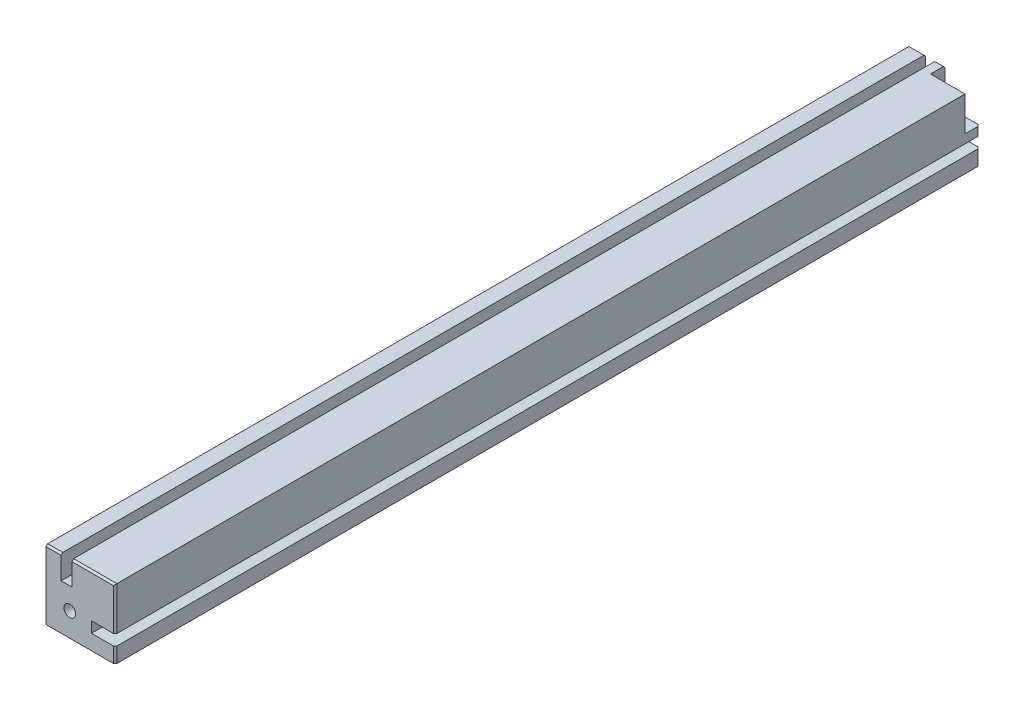
ISO-10303-21;
HEADER;
FILE_DESCRIPTION(('STEP AP214'),'2;1');
FILE_NAME('part.step','',(''),(''),'','','');
FILE_SCHEMA(('AUTOMOTIVE_DESIGN { 1 0 10303 214 1 1 1 1 }'));
ENDSEC;
DATA;
#1=APPLICATION_CONTEXT('core data for automotive mechanical design processes');
#2=APPLICATION_PROTOCOL_DEFINITION('international standard','automotive_design',2000,#1);
#3=PRODUCT_CONTEXT('',#1,'mechanical');
#4=PRODUCT('Part','Part','',(#3));
#5=PRODUCT_RELATED_PRODUCT_CATEGORY('part','',(#4));
#6=PRODUCT_DEFINITION_FORMATION('','',#4);
#7=PRODUCT_DEFINITION_CONTEXT('part definition',#1,'design');
#8=PRODUCT_DEFINITION('design','',#6,#7);
#9=PRODUCT_DEFINITION_SHAPE('','',#8);
#10=(LENGTH_UNIT() NAMED_UNIT(*) SI_UNIT(.MILLI.,.METRE.));
#11=(NAMED_UNIT(*) PLANE_ANGLE_UNIT() SI_UNIT($,.RADIAN.));
#12=(NAMED_UNIT(*) SI_UNIT($,.STERADIAN.) SOLID_ANGLE_UNIT());
#13=UNCERTAINTY_MEASURE_WITH_UNIT(LENGTH_MEASURE(1.E-05),#10,'distance_accuracy_value','');
#14=(GEOMETRIC_REPRESENTATION_CONTEXT(3) GLOBAL_UNCERTAINTY_ASSIGNED_CONTEXT((#13)) GLOBAL_UNIT_ASSIGNED_CONTEXT((#10,
#11,#12)) REPRESENTATION_CONTEXT('',''));
#15=CARTESIAN_POINT('',(0.,0.,0.));
#16=DIRECTION('',(0.,0.,1.));
#17=DIRECTION('',(1.,0.,0.));
#18=AXIS2_PLACEMENT_3D('',#15,#16,#17);
#19=CARTESIAN_POINT('',(-55.8158460090952,14.9214285714286,200.));
#20=DIRECTION('',(-1.,0.,0.));
#21=DIRECTION('',(0.,-1.,0.));
#22=AXIS2_PLACEMENT_3D('',#19,#20,#21);
#23=PLANE('',#22);
#24=DIRECTION('',(0.,0.,1.));
#25=VECTOR('',#24,1.);
#26=CARTESIAN_POINT('',(-55.8158460090952,2.42142857142858,0.));
#27=LINE('',#26,#25);
#28=CARTESIAN_POINT('',(-55.8158460090952,2.42142857142858,0.399999999999963));
#29=VERTEX_POINT('',#28);
#30=CARTESIAN_POINT('',(-55.8158460090952,2.42142857142858,199.6));
#31=VERTEX_POINT('',#30);
#32=EDGE_CURVE('E274',#29,#31,#27,.T.);
#33=ORIENTED_EDGE('',*,*,#32,.T.);
#34=DIRECTION('',(0.,-1.,0.));
#35=VECTOR('',#34,1.);
#36=CARTESIAN_POINT('',(-55.8158460090952,-1.07857142857142,199.6));
#37=LINE('',#36,#35);
#38=CARTESIAN_POINT('',(-55.8158460090952,-1.07857142857142,199.6));
#39=VERTEX_POINT('',#38);
#40=EDGE_CURVE('E355',#31,#39,#37,.T.);
#41=ORIENTED_EDGE('',*,*,#40,.T.);
#42=DIRECTION('',(0.,0.,-1.));
#43=VECTOR('',#42,1.);
#44=CARTESIAN_POINT('',(-55.8158460090952,-1.07857142857142,200.));
#45=LINE('',#44,#43);
#46=CARTESIAN_POINT('',(-55.8158460090952,-1.07857142857142,0.399999999999963));
#47=VERTEX_POINT('',#46);
#48=EDGE_CURVE('E322',#39,#47,#45,.T.);
#49=ORIENTED_EDGE('',*,*,#48,.T.);
#50=DIRECTION('',(0.,1.,0.));
#51=VECTOR('',#50,1.);
#52=CARTESIAN_POINT('',(-55.8158460090952,14.9214285714286,0.399999999999963));
#53=LINE('',#52,#51);
#54=EDGE_CURVE('E352',#47,#29,#53,.T.);
#55=ORIENTED_EDGE('',*,*,#54,.T.);
#56=EDGE_LOOP('',(#33,#41,#49,#55));
#57=FACE_BOUND('',#56,.T.);
#58=ADVANCED_FACE('F39',(#57),#23,.F.);
#59=CARTESIAN_POINT('',(-71.8158460090952,14.9214285714286,200.));
#60=DIRECTION('',(0.,-1.,0.));
#61=DIRECTION('',(0.,0.,-1.));
#62=AXIS2_PLACEMENT_3D('',#59,#60,#61);
#63=PLANE('',#62);
#64=DIRECTION('',(0.,0.,-1.));
#65=VECTOR('',#64,1.);
#66=CARTESIAN_POINT('',(-71.8158460090952,14.9214285714286,200.));
#67=LINE('',#66,#65);
#68=CARTESIAN_POINT('',(-71.8158460090952,14.9214285714286,199.6));
#69=VERTEX_POINT('',#68);
#70=CARTESIAN_POINT('',(-71.8158460090952,14.9214285714286,0.399999999999963));
#71=VERTEX_POINT('',#70);
#72=EDGE_CURVE('E331',#69,#71,#67,.T.);
#73=ORIENTED_EDGE('',*,*,#72,.F.);
#74=DIRECTION('',(1.,0.,0.));
#75=VECTOR('',#74,1.);
#76=CARTESIAN_POINT('',(-68.3158460090952,14.9214285714286,199.6));
#77=LINE('',#76,#75);
#78=CARTESIAN_POINT('',(-68.3158460090952,14.9214285714286,199.6));
#79=VERTEX_POINT('',#78);
#80=EDGE_CURVE('E384',#69,#79,#77,.T.);
#81=ORIENTED_EDGE('',*,*,#80,.T.);
#82=DIRECTION('',(0.,0.,1.));
#83=VECTOR('',#82,1.);
#84=CARTESIAN_POINT('',(-68.3158460090952,14.9214285714286,0.));
#85=LINE('',#84,#83);
#86=CARTESIAN_POINT('',(-68.3158460090952,14.9214285714286,0.399999999999963));
#87=VERTEX_POINT('',#86);
#88=EDGE_CURVE('E279',#87,#79,#85,.T.);
#89=ORIENTED_EDGE('',*,*,#88,.F.);
#90=DIRECTION('',(-1.,0.,0.));
#91=VECTOR('',#90,1.);
#92=CARTESIAN_POINT('',(-71.8158460090952,14.9214285714286,0.399999999999963));
#93=LINE('',#92,#91);
#94=EDGE_CURVE('E381',#87,#71,#93,.T.);
#95=ORIENTED_EDGE('',*,*,#94,.T.);
#96=EDGE_LOOP('',(#73,#81,#89,#95));
#97=FACE_BOUND('',#96,.T.);
#98=ADVANCED_FACE('F506',(#97),#63,.F.);
#99=DIRECTION('',(0.,0.,-1.));
#100=VECTOR('',#99,1.);
#101=CARTESIAN_POINT('',(-55.8158460090952,6.92142857142858,3.));
#102=LINE('',#101,#100);
#103=CARTESIAN_POINT('',(-55.8158460090952,6.92142857142858,3.39999999999999));
#104=VERTEX_POINT('',#103);
#105=CARTESIAN_POINT('',(-55.8158460090952,6.92142857142858,0.39999999999997));
#106=VERTEX_POINT('',#105);
#107=EDGE_CURVE('E63',#104,#106,#102,.T.);
#108=ORIENTED_EDGE('',*,*,#107,.F.);
#109=DIRECTION('',(0.,1.,0.));
#110=VECTOR('',#109,1.);
#111=CARTESIAN_POINT('',(-55.8158460090952,14.9214285714286,3.39999999999999));
#112=LINE('',#111,#110);
#113=CARTESIAN_POINT('',(-55.8158460090952,14.9214285714286,3.39999999999999));
#114=VERTEX_POINT('',#113);
#115=EDGE_CURVE('E407',#104,#114,#112,.T.);
#116=ORIENTED_EDGE('',*,*,#115,.T.);
#117=DIRECTION('',(0.,0.,-1.));
#118=VECTOR('',#117,1.);
#119=CARTESIAN_POINT('',(-55.8158460090952,14.9214285714286,200.));
#120=LINE('',#119,#118);
#121=CARTESIAN_POINT('',(-55.8158460090952,14.9214285714286,199.6));
#122=VERTEX_POINT('',#121);
#123=EDGE_CURVE('E334',#122,#114,#120,.T.);
#124=ORIENTED_EDGE('',*,*,#123,.F.);
#125=DIRECTION('',(0.,-1.,0.));
#126=VECTOR('',#125,1.);
#127=CARTESIAN_POINT('',(-55.8158460090952,4.92142857142858,199.6));
#128=LINE('',#127,#126);
#129=CARTESIAN_POINT('',(-55.8158460090952,4.92142857142858,199.6));
#130=VERTEX_POINT('',#129);
#131=EDGE_CURVE('E363',#122,#130,#128,.T.);
#132=ORIENTED_EDGE('',*,*,#131,.T.);
#133=DIRECTION('',(0.,0.,1.));
#134=VECTOR('',#133,1.);
#135=CARTESIAN_POINT('',(-55.8158460090952,4.92142857142858,0.));
#136=LINE('',#135,#134);
#137=CARTESIAN_POINT('',(-55.8158460090952,4.92142857142858,0.399999999999963));
#138=VERTEX_POINT('',#137);
#139=EDGE_CURVE('E299',#138,#130,#136,.T.);
#140=ORIENTED_EDGE('',*,*,#139,.F.);
#141=DIRECTION('',(0.,1.,0.));
#142=VECTOR('',#141,1.);
#143=CARTESIAN_POINT('',(-55.8158460090952,14.9214285714286,0.399999999999963));
#144=LINE('',#143,#142);
#145=EDGE_CURVE('E361',#138,#106,#144,.T.);
#146=ORIENTED_EDGE('',*,*,#145,.T.);
#147=EDGE_LOOP('',(#108,#116,#124,#132,#140,#146));
#148=FACE_BOUND('',#147,.T.);
#149=ADVANCED_FACE('F418',(#148),#23,.F.);
#150=ORIENTED_EDGE('',*,*,#123,.T.);
#151=DIRECTION('',(-1.,0.,0.));
#152=VECTOR('',#151,1.);
#153=CARTESIAN_POINT('',(-63.8158460090952,14.9214285714286,3.39999999999999));
#154=LINE('',#153,#152);
#155=CARTESIAN_POINT('',(-63.8158460090952,14.9214285714286,3.39999999999999));
#156=VERTEX_POINT('',#155);
#157=EDGE_CURVE('E409',#114,#156,#154,.T.);
#158=ORIENTED_EDGE('',*,*,#157,.T.);
#159=DIRECTION('',(0.,0.,-1.));
#160=VECTOR('',#159,1.);
#161=CARTESIAN_POINT('',(-63.8158460090952,14.9214285714286,3.));
#162=LINE('',#161,#160);
#163=CARTESIAN_POINT('',(-63.8158460090952,14.9214285714286,0.399999999999964));
#164=VERTEX_POINT('',#163);
#165=EDGE_CURVE('E55',#156,#164,#162,.T.);
#166=ORIENTED_EDGE('',*,*,#165,.T.);
#167=DIRECTION('',(-1.,0.,0.));
#168=VECTOR('',#167,1.);
#169=CARTESIAN_POINT('',(-71.8158460090952,14.9214285714286,0.399999999999963));
#170=LINE('',#169,#168);
#171=CARTESIAN_POINT('',(-65.8158460090952,14.9214285714286,0.399999999999963));
#172=VERTEX_POINT('',#171);
#173=EDGE_CURVE('E373',#164,#172,#170,.T.);
#174=ORIENTED_EDGE('',*,*,#173,.T.);
#175=DIRECTION('',(0.,0.,1.));
#176=VECTOR('',#175,1.);
#177=CARTESIAN_POINT('',(-65.8158460090952,14.9214285714286,0.));
#178=LINE('',#177,#176);
#179=CARTESIAN_POINT('',(-65.8158460090952,14.9214285714286,199.6));
#180=VERTEX_POINT('',#179);
#181=EDGE_CURVE('E283',#172,#180,#178,.T.);
#182=ORIENTED_EDGE('',*,*,#181,.T.);
#183=DIRECTION('',(1.,0.,0.));
#184=VECTOR('',#183,1.);
#185=CARTESIAN_POINT('',(-55.8158460090952,14.9214285714286,199.6));
#186=LINE('',#185,#184);
#187=EDGE_CURVE('E375',#180,#122,#186,.T.);
#188=ORIENTED_EDGE('',*,*,#187,.T.);
#189=EDGE_LOOP('',(#150,#158,#166,#174,#182,#188));
#190=FACE_BOUND('',#189,.T.);
#191=ADVANCED_FACE('F422',(#190),#63,.F.);
#192=CARTESIAN_POINT('',(-71.8158460090952,14.9214285714286,200.));
#193=DIRECTION('',(1.,0.,0.));
#194=DIRECTION('',(0.,1.,0.));
#195=AXIS2_PLACEMENT_3D('',#192,#193,#194);
#196=PLANE('',#195);
#197=DIRECTION('',(0.,-1.,0.));
#198=VECTOR('',#197,1.);
#199=CARTESIAN_POINT('',(-71.8158460090952,14.9214285714286,200.));
#200=LINE('',#199,#198);
#201=CARTESIAN_POINT('',(-71.8158460090952,14.5214285714286,200.));
#202=VERTEX_POINT('',#201);
#203=CARTESIAN_POINT('',(-71.8158460090952,-1.07857142857142,200.));
#204=VERTEX_POINT('',#203);
#205=EDGE_CURVE('E316',#202,#204,#200,.T.);
#206=ORIENTED_EDGE('',*,*,#205,.F.);
#207=DIRECTION('',(0.,0.707106781186548,-0.707106781186548));
#208=VECTOR('',#207,1.);
#209=CARTESIAN_POINT('',(-71.8158460090952,14.5214285714286,200.));
#210=LINE('',#209,#208);
#211=EDGE_CURVE('E379',#202,#69,#210,.T.);
#212=ORIENTED_EDGE('',*,*,#211,.T.);
#213=ORIENTED_EDGE('',*,*,#72,.T.);
#214=DIRECTION('',(0.,0.707106781186548,0.707106781186548));
#215=VECTOR('',#214,1.);
#216=CARTESIAN_POINT('',(-71.8158460090952,14.9214285714286,0.399999999999963));
#217=LINE('',#216,#215);
#218=CARTESIAN_POINT('',(-71.8158460090952,14.5214285714286,0.));
#219=VERTEX_POINT('',#218);
#220=EDGE_CURVE('E377',#71,#219,#217,.F.);
#221=ORIENTED_EDGE('',*,*,#220,.T.);
#222=DIRECTION('',(0.,-1.,0.));
#223=VECTOR('',#222,1.);
#224=CARTESIAN_POINT('',(-71.8158460090952,14.9214285714286,0.));
#225=LINE('',#224,#223);
#226=CARTESIAN_POINT('',(-71.8158460090952,-1.07857142857142,0.));
#227=VERTEX_POINT('',#226);
#228=EDGE_CURVE('E282',#219,#227,#225,.T.);
#229=ORIENTED_EDGE('',*,*,#228,.T.);
#230=DIRECTION('',(0.,0.,-1.));
#231=VECTOR('',#230,1.);
#232=CARTESIAN_POINT('',(-71.8158460090952,-1.07857142857142,200.));
#233=LINE('',#232,#231);
#234=EDGE_CURVE('E328',#204,#227,#233,.T.);
#235=ORIENTED_EDGE('',*,*,#234,.F.);
#236=EDGE_LOOP('',(#206,#212,#213,#221,#229,#235));
#237=FACE_BOUND('',#236,.T.);
#238=ADVANCED_FACE('F491',(#237),#196,.F.);
#239=CARTESIAN_POINT('',(-71.8158460090952,-1.07857142857142,200.));
#240=DIRECTION('',(0.,1.,0.));
#241=DIRECTION('',(0.,0.,1.));
#242=AXIS2_PLACEMENT_3D('',#239,#240,#241);
#243=PLANE('',#242);
#244=ORIENTED_EDGE('',*,*,#48,.F.);
#245=DIRECTION('',(-0.707106781186548,0.,0.707106781186548));
#246=VECTOR('',#245,1.);
#247=CARTESIAN_POINT('',(-56.2158460090952,-1.07857142857142,200.));
#248=LINE('',#247,#246);
#249=CARTESIAN_POINT('',(-56.2158460090952,-1.07857142857142,200.));
#250=VERTEX_POINT('',#249);
#251=EDGE_CURVE('E359',#39,#250,#248,.T.);
#252=ORIENTED_EDGE('',*,*,#251,.T.);
#253=DIRECTION('',(1.,0.,0.));
#254=VECTOR('',#253,1.);
#255=CARTESIAN_POINT('',(-71.8158460090952,-1.07857142857142,200.));
#256=LINE('',#255,#254);
#257=EDGE_CURVE('E318',#204,#250,#256,.T.);
#258=ORIENTED_EDGE('',*,*,#257,.F.);
#259=ORIENTED_EDGE('',*,*,#234,.T.);
#260=DIRECTION('',(1.,0.,0.));
#261=VECTOR('',#260,1.);
#262=CARTESIAN_POINT('',(-71.8158460090952,-1.07857142857142,0.));
#263=LINE('',#262,#261);
#264=CARTESIAN_POINT('',(-56.2158460090952,-1.07857142857142,0.));
#265=VERTEX_POINT('',#264);
#266=EDGE_CURVE('E319',#227,#265,#263,.T.);
#267=ORIENTED_EDGE('',*,*,#266,.T.);
#268=DIRECTION('',(-0.707106781186548,0.,-0.707106781186548));
#269=VECTOR('',#268,1.);
#270=CARTESIAN_POINT('',(-55.8158460090952,-1.07857142857142,0.399999999999961));
#271=LINE('',#270,#269);
#272=EDGE_CURVE('E357',#265,#47,#271,.F.);
#273=ORIENTED_EDGE('',*,*,#272,.T.);
#274=EDGE_LOOP('',(#244,#252,#258,#259,#267,#273));
#275=FACE_BOUND('',#274,.T.);
#276=ADVANCED_FACE('F479',(#275),#243,.F.);
#277=CARTESIAN_POINT('',(-63.8158460090952,6.92142857142858,200.));
#278=DIRECTION('',(0.,0.,1.));
#279=DIRECTION('',(1.,0.,0.));
#280=AXIS2_PLACEMENT_3D('',#277,#278,#279);
#281=PLANE('',#280);
#282=CARTESIAN_POINT('',(-66.3158460090952,4.42142857142858,200.));
#283=DIRECTION('',(0.,0.,1.));
#284=DIRECTION('',(1.,0.,0.));
#285=AXIS2_PLACEMENT_3D('',#282,#283,#284);
#286=CIRCLE('',#285,1.34999999999999);
#287=CARTESIAN_POINT('',(-64.9658460090952,4.42142857142858,200.));
#288=VERTEX_POINT('',#287);
#289=EDGE_CURVE('E246',#288,#288,#286,.T.);
#290=ORIENTED_EDGE('',*,*,#289,.F.);
#291=EDGE_LOOP('',(#290));
#292=FACE_BOUND('',#291,.T.);
#293=ORIENTED_EDGE('',*,*,#257,.T.);
#294=DIRECTION('',(0.,1.,0.));
#295=VECTOR('',#294,1.);
#296=CARTESIAN_POINT('',(-56.2158460090952,2.42142857142858,200.));
#297=LINE('',#296,#295);
#298=CARTESIAN_POINT('',(-56.2158460090952,2.42142857142858,200.));
#299=VERTEX_POINT('',#298);
#300=EDGE_CURVE('E345',#250,#299,#297,.T.);
#301=ORIENTED_EDGE('',*,*,#300,.T.);
#302=DIRECTION('',(1.,0.,0.));
#303=VECTOR('',#302,1.);
#304=CARTESIAN_POINT('',(-55.8158460090952,2.42142857142858,200.));
#305=LINE('',#304,#303);
#306=CARTESIAN_POINT('',(-61.3158460090952,2.42142857142858,200.));
#307=VERTEX_POINT('',#306);
#308=EDGE_CURVE('E293',#307,#299,#305,.T.);
#309=ORIENTED_EDGE('',*,*,#308,.F.);
#310=DIRECTION('',(0.,-1.,0.));
#311=VECTOR('',#310,1.);
#312=CARTESIAN_POINT('',(-61.3158460090952,2.42142857142858,200.));
#313=LINE('',#312,#311);
#314=CARTESIAN_POINT('',(-61.3158460090952,4.92142857142858,200.));
#315=VERTEX_POINT('',#314);
#316=EDGE_CURVE('E302',#315,#307,#313,.T.);
#317=ORIENTED_EDGE('',*,*,#316,.F.);
#318=DIRECTION('',(-1.,0.,0.));
#319=VECTOR('',#318,1.);
#320=CARTESIAN_POINT('',(-55.8158460090952,4.92142857142858,200.));
#321=LINE('',#320,#319);
#322=CARTESIAN_POINT('',(-56.2158460090952,4.92142857142858,200.));
#323=VERTEX_POINT('',#322);
#324=EDGE_CURVE('E300',#323,#315,#321,.T.);
#325=ORIENTED_EDGE('',*,*,#324,.F.);
#326=DIRECTION('',(0.,1.,0.));
#327=VECTOR('',#326,1.);
#328=CARTESIAN_POINT('',(-56.2158460090952,14.9214285714286,200.));
#329=LINE('',#328,#327);
#330=CARTESIAN_POINT('',(-56.2158460090952,14.5214285714286,200.));
#331=VERTEX_POINT('',#330);
#332=EDGE_CURVE('E342',#323,#331,#329,.T.);
#333=ORIENTED_EDGE('',*,*,#332,.T.);
#334=DIRECTION('',(-1.,0.,0.));
#335=VECTOR('',#334,1.);
#336=CARTESIAN_POINT('',(-65.8158460090952,14.5214285714286,200.));
#337=LINE('',#336,#335);
#338=CARTESIAN_POINT('',(-65.8158460090952,14.5214285714286,200.));
#339=VERTEX_POINT('',#338);
#340=EDGE_CURVE('E340',#331,#339,#337,.T.);
#341=ORIENTED_EDGE('',*,*,#340,.T.);
#342=DIRECTION('',(0.,1.,0.));
#343=VECTOR('',#342,1.);
#344=CARTESIAN_POINT('',(-65.8158460090952,14.9214285714286,200.));
#345=LINE('',#344,#343);
#346=CARTESIAN_POINT('',(-65.8158460090952,9.42142857142858,200.));
#347=VERTEX_POINT('',#346);
#348=EDGE_CURVE('E264',#347,#339,#345,.T.);
#349=ORIENTED_EDGE('',*,*,#348,.F.);
#350=DIRECTION('',(1.,0.,0.));
#351=VECTOR('',#350,1.);
#352=CARTESIAN_POINT('',(-68.3158460090952,9.42142857142858,200.));
#353=LINE('',#352,#351);
#354=CARTESIAN_POINT('',(-68.3158460090952,9.42142857142858,200.));
#355=VERTEX_POINT('',#354);
#356=EDGE_CURVE('E273',#355,#347,#353,.T.);
#357=ORIENTED_EDGE('',*,*,#356,.F.);
#358=DIRECTION('',(0.,-1.,0.));
#359=VECTOR('',#358,1.);
#360=CARTESIAN_POINT('',(-68.3158460090952,14.9214285714286,200.));
#361=LINE('',#360,#359);
#362=CARTESIAN_POINT('',(-68.3158460090952,14.5214285714286,200.));
#363=VERTEX_POINT('',#362);
#364=EDGE_CURVE('E271',#363,#355,#361,.T.);
#365=ORIENTED_EDGE('',*,*,#364,.F.);
#366=DIRECTION('',(-1.,0.,0.));
#367=VECTOR('',#366,1.);
#368=CARTESIAN_POINT('',(-71.8158460090952,14.5214285714286,200.));
#369=LINE('',#368,#367);
#370=EDGE_CURVE('E337',#363,#202,#369,.T.);
#371=ORIENTED_EDGE('',*,*,#370,.T.);
#372=ORIENTED_EDGE('',*,*,#205,.T.);
#373=EDGE_LOOP('',(#293,#301,#309,#317,#325,#333,#341,#349,#357,#365,#371,#372));
#374=FACE_BOUND('',#373,.T.);
#375=ADVANCED_FACE('F465',(#292,#374),#281,.T.);
#376=CARTESIAN_POINT('',(-63.8158460090952,6.92142857142858,0.));
#377=DIRECTION('',(0.,0.,1.));
#378=DIRECTION('',(1.,0.,0.));
#379=AXIS2_PLACEMENT_3D('',#376,#377,#378);
#380=PLANE('',#379);
#381=CARTESIAN_POINT('',(-66.3158460090952,4.42142857142858,0.));
#382=DIRECTION('',(0.,0.,-1.));
#383=DIRECTION('',(-1.,0.,0.));
#384=AXIS2_PLACEMENT_3D('',#381,#382,#383);
#385=CIRCLE('',#384,1.34999999999999);
#386=CARTESIAN_POINT('',(-67.6658460090952,4.42142857142858,0.));
#387=VERTEX_POINT('',#386);
#388=EDGE_CURVE('E254',#387,#387,#385,.T.);
#389=ORIENTED_EDGE('',*,*,#388,.F.);
#390=EDGE_LOOP('',(#389));
#391=FACE_BOUND('',#390,.T.);
#392=DIRECTION('',(1.,0.,0.));
#393=VECTOR('',#392,1.);
#394=CARTESIAN_POINT('',(-63.8158460090952,14.5214285714286,0.));
#395=LINE('',#394,#393);
#396=CARTESIAN_POINT('',(-65.8158460090952,14.5214285714286,0.));
#397=VERTEX_POINT('',#396);
#398=CARTESIAN_POINT('',(-63.8158460090952,14.5214285714286,0.));
#399=VERTEX_POINT('',#398);
#400=EDGE_CURVE('E394',#397,#399,#395,.T.);
#401=ORIENTED_EDGE('',*,*,#400,.T.);
#402=DIRECTION('',(0.,1.,0.));
#403=VECTOR('',#402,1.);
#404=CARTESIAN_POINT('',(-63.8158460090952,14.9214285714286,0.));
#405=LINE('',#404,#403);
#406=CARTESIAN_POINT('',(-63.8158460090952,9.92142857142858,0.));
#407=VERTEX_POINT('',#406);
#408=EDGE_CURVE('E223',#407,#399,#405,.T.);
#409=ORIENTED_EDGE('',*,*,#408,.F.);
#410=CARTESIAN_POINT('',(-60.8158460090952,9.92142857142858,0.));
#411=DIRECTION('',(0.,0.,-1.));
#412=DIRECTION('',(-1.,0.,0.));
#413=AXIS2_PLACEMENT_3D('',#410,#411,#412);
#414=CIRCLE('',#413,3.);
#415=CARTESIAN_POINT('',(-60.8158460090952,6.92142857142858,0.));
#416=VERTEX_POINT('',#415);
#417=EDGE_CURVE('E242',#416,#407,#414,.T.);
#418=ORIENTED_EDGE('',*,*,#417,.F.);
#419=DIRECTION('',(-1.,0.,0.));
#420=VECTOR('',#419,1.);
#421=CARTESIAN_POINT('',(-55.8158460090952,6.92142857142858,0.));
#422=LINE('',#421,#420);
#423=CARTESIAN_POINT('',(-56.2158460090951,6.92142857142858,0.));
#424=VERTEX_POINT('',#423);
#425=EDGE_CURVE('E229',#424,#416,#422,.T.);
#426=ORIENTED_EDGE('',*,*,#425,.F.);
#427=DIRECTION('',(0.,-1.,0.));
#428=VECTOR('',#427,1.);
#429=CARTESIAN_POINT('',(-56.2158460090952,6.92142857142858,0.));
#430=LINE('',#429,#428);
#431=CARTESIAN_POINT('',(-56.2158460090952,4.92142857142858,0.));
#432=VERTEX_POINT('',#431);
#433=EDGE_CURVE('E392',#424,#432,#430,.T.);
#434=ORIENTED_EDGE('',*,*,#433,.T.);
#435=DIRECTION('',(-1.,0.,0.));
#436=VECTOR('',#435,1.);
#437=CARTESIAN_POINT('',(-55.8158460090952,4.92142857142858,0.));
#438=LINE('',#437,#436);
#439=CARTESIAN_POINT('',(-61.3158460090952,4.92142857142858,0.));
#440=VERTEX_POINT('',#439);
#441=EDGE_CURVE('E290',#432,#440,#438,.T.);
#442=ORIENTED_EDGE('',*,*,#441,.T.);
#443=DIRECTION('',(0.,-1.,0.));
#444=VECTOR('',#443,1.);
#445=CARTESIAN_POINT('',(-61.3158460090952,2.42142857142858,0.));
#446=LINE('',#445,#444);
#447=CARTESIAN_POINT('',(-61.3158460090952,2.42142857142858,0.));
#448=VERTEX_POINT('',#447);
#449=EDGE_CURVE('E292',#440,#448,#446,.T.);
#450=ORIENTED_EDGE('',*,*,#449,.T.);
#451=DIRECTION('',(1.,0.,0.));
#452=VECTOR('',#451,1.);
#453=CARTESIAN_POINT('',(-55.8158460090952,2.42142857142858,0.));
#454=LINE('',#453,#452);
#455=CARTESIAN_POINT('',(-56.2158460090952,2.42142857142858,0.));
#456=VERTEX_POINT('',#455);
#457=EDGE_CURVE('E296',#448,#456,#454,.T.);
#458=ORIENTED_EDGE('',*,*,#457,.T.);
#459=DIRECTION('',(0.,-1.,0.));
#460=VECTOR('',#459,1.);
#461=CARTESIAN_POINT('',(-56.2158460090952,6.92142857142858,0.));
#462=LINE('',#461,#460);
#463=EDGE_CURVE('E397',#456,#265,#462,.T.);
#464=ORIENTED_EDGE('',*,*,#463,.T.);
#465=ORIENTED_EDGE('',*,*,#266,.F.);
#466=ORIENTED_EDGE('',*,*,#228,.F.);
#467=DIRECTION('',(1.,0.,0.));
#468=VECTOR('',#467,1.);
#469=CARTESIAN_POINT('',(-63.8158460090952,14.5214285714286,0.));
#470=LINE('',#469,#468);
#471=CARTESIAN_POINT('',(-68.3158460090952,14.5214285714286,0.));
#472=VERTEX_POINT('',#471);
#473=EDGE_CURVE('E390',#219,#472,#470,.T.);
#474=ORIENTED_EDGE('',*,*,#473,.T.);
#475=DIRECTION('',(0.,-1.,0.));
#476=VECTOR('',#475,1.);
#477=CARTESIAN_POINT('',(-68.3158460090952,14.9214285714286,0.));
#478=LINE('',#477,#476);
#479=CARTESIAN_POINT('',(-68.3158460090952,9.42142857142858,0.));
#480=VERTEX_POINT('',#479);
#481=EDGE_CURVE('E261',#472,#480,#478,.T.);
#482=ORIENTED_EDGE('',*,*,#481,.T.);
#483=DIRECTION('',(1.,0.,0.));
#484=VECTOR('',#483,1.);
#485=CARTESIAN_POINT('',(-68.3158460090952,9.42142857142858,0.));
#486=LINE('',#485,#484);
#487=CARTESIAN_POINT('',(-65.8158460090952,9.42142857142858,0.));
#488=VERTEX_POINT('',#487);
#489=EDGE_CURVE('E263',#480,#488,#486,.T.);
#490=ORIENTED_EDGE('',*,*,#489,.T.);
#491=DIRECTION('',(0.,1.,0.));
#492=VECTOR('',#491,1.);
#493=CARTESIAN_POINT('',(-65.8158460090952,14.9214285714286,0.));
#494=LINE('',#493,#492);
#495=EDGE_CURVE('E267',#488,#397,#494,.T.);
#496=ORIENTED_EDGE('',*,*,#495,.T.);
#497=EDGE_LOOP('',(#401,#409,#418,#426,#434,#442,#450,#458,#464,#465,#466,#474,#482,#490,#496));
#498=FACE_BOUND('',#497,.T.);
#499=ADVANCED_FACE('F431',(#391,#498),#380,.F.);
#500=CARTESIAN_POINT('',(-55.8158460090952,2.42142857142858,0.));
#501=DIRECTION('',(0.,-1.,0.));
#502=DIRECTION('',(1.,0.,0.));
#503=AXIS2_PLACEMENT_3D('',#500,#501,#502);
#504=PLANE('',#503);
#505=ORIENTED_EDGE('',*,*,#308,.T.);
#506=DIRECTION('',(0.707106781186548,0.,-0.707106781186548));
#507=VECTOR('',#506,1.);
#508=CARTESIAN_POINT('',(-56.2158460090952,2.42142857142858,200.));
#509=LINE('',#508,#507);
#510=EDGE_CURVE('E350',#299,#31,#509,.T.);
#511=ORIENTED_EDGE('',*,*,#510,.T.);
#512=ORIENTED_EDGE('',*,*,#32,.F.);
#513=DIRECTION('',(0.707106781186548,0.,0.707106781186548));
#514=VECTOR('',#513,1.);
#515=CARTESIAN_POINT('',(-55.8158460090952,2.42142857142858,0.399999999999963));
#516=LINE('',#515,#514);
#517=EDGE_CURVE('E348',#29,#456,#516,.F.);
#518=ORIENTED_EDGE('',*,*,#517,.T.);
#519=ORIENTED_EDGE('',*,*,#457,.F.);
#520=DIRECTION('',(0.,0.,1.));
#521=VECTOR('',#520,1.);
#522=CARTESIAN_POINT('',(-61.3158460090952,2.42142857142858,0.));
#523=LINE('',#522,#521);
#524=EDGE_CURVE('E309',#448,#307,#523,.T.);
#525=ORIENTED_EDGE('',*,*,#524,.T.);
#526=EDGE_LOOP('',(#505,#511,#512,#518,#519,#525));
#527=FACE_BOUND('',#526,.T.);
#528=ADVANCED_FACE('F469',(#527),#504,.F.);
#529=CARTESIAN_POINT('',(-61.3158460090952,2.42142857142858,0.));
#530=DIRECTION('',(-1.,0.,0.));
#531=DIRECTION('',(0.,0.,1.));
#532=AXIS2_PLACEMENT_3D('',#529,#530,#531);
#533=PLANE('',#532);
#534=ORIENTED_EDGE('',*,*,#316,.T.);
#535=ORIENTED_EDGE('',*,*,#524,.F.);
#536=ORIENTED_EDGE('',*,*,#449,.F.);
#537=DIRECTION('',(0.,0.,1.));
#538=VECTOR('',#537,1.);
#539=CARTESIAN_POINT('',(-61.3158460090952,4.92142857142858,0.));
#540=LINE('',#539,#538);
#541=EDGE_CURVE('E311',#440,#315,#540,.T.);
#542=ORIENTED_EDGE('',*,*,#541,.T.);
#543=EDGE_LOOP('',(#534,#535,#536,#542));
#544=FACE_BOUND('',#543,.T.);
#545=ADVANCED_FACE('F461',(#544),#533,.F.);
#546=CARTESIAN_POINT('',(-55.8158460090952,4.92142857142858,0.));
#547=DIRECTION('',(0.,1.,0.));
#548=DIRECTION('',(-1.,0.,0.));
#549=AXIS2_PLACEMENT_3D('',#546,#547,#548);
#550=PLANE('',#549);
#551=ORIENTED_EDGE('',*,*,#139,.T.);
#552=DIRECTION('',(-0.707106781186548,0.,0.707106781186548));
#553=VECTOR('',#552,1.);
#554=CARTESIAN_POINT('',(-56.2158460090952,4.92142857142858,200.));
#555=LINE('',#554,#553);
#556=EDGE_CURVE('E367',#130,#323,#555,.T.);
#557=ORIENTED_EDGE('',*,*,#556,.T.);
#558=ORIENTED_EDGE('',*,*,#324,.T.);
#559=ORIENTED_EDGE('',*,*,#541,.F.);
#560=ORIENTED_EDGE('',*,*,#441,.F.);
#561=DIRECTION('',(-0.707106781186548,0.,-0.707106781186548));
#562=VECTOR('',#561,1.);
#563=CARTESIAN_POINT('',(-55.8158460090952,4.92142857142858,0.399999999999963));
#564=LINE('',#563,#562);
#565=EDGE_CURVE('E365',#432,#138,#564,.F.);
#566=ORIENTED_EDGE('',*,*,#565,.T.);
#567=EDGE_LOOP('',(#551,#557,#558,#559,#560,#566));
#568=FACE_BOUND('',#567,.T.);
#569=ADVANCED_FACE('F451',(#568),#550,.F.);
#570=CARTESIAN_POINT('',(-68.3158460090952,14.9214285714286,0.));
#571=DIRECTION('',(-1.,0.,0.));
#572=DIRECTION('',(0.,-1.,0.));
#573=AXIS2_PLACEMENT_3D('',#570,#571,#572);
#574=PLANE('',#573);
#575=ORIENTED_EDGE('',*,*,#88,.T.);
#576=DIRECTION('',(0.,-0.707106781186548,0.707106781186548));
#577=VECTOR('',#576,1.);
#578=CARTESIAN_POINT('',(-68.3158460090952,14.5214285714286,200.));
#579=LINE('',#578,#577);
#580=EDGE_CURVE('E388',#79,#363,#579,.T.);
#581=ORIENTED_EDGE('',*,*,#580,.T.);
#582=ORIENTED_EDGE('',*,*,#364,.T.);
#583=DIRECTION('',(0.,0.,1.));
#584=VECTOR('',#583,1.);
#585=CARTESIAN_POINT('',(-68.3158460090952,9.42142857142858,0.));
#586=LINE('',#585,#584);
#587=EDGE_CURVE('E270',#480,#355,#586,.T.);
#588=ORIENTED_EDGE('',*,*,#587,.F.);
#589=ORIENTED_EDGE('',*,*,#481,.F.);
#590=DIRECTION('',(0.,-0.707106781186548,-0.707106781186548));
#591=VECTOR('',#590,1.);
#592=CARTESIAN_POINT('',(-68.3158460090952,14.9214285714286,0.399999999999963));
#593=LINE('',#592,#591);
#594=EDGE_CURVE('E386',#472,#87,#593,.F.);
#595=ORIENTED_EDGE('',*,*,#594,.T.);
#596=EDGE_LOOP('',(#575,#581,#582,#588,#589,#595));
#597=FACE_BOUND('',#596,.T.);
#598=ADVANCED_FACE('F501',(#597),#574,.F.);
#599=CARTESIAN_POINT('',(-65.8158460090952,14.9214285714286,0.));
#600=DIRECTION('',(1.,0.,0.));
#601=DIRECTION('',(0.,1.,0.));
#602=AXIS2_PLACEMENT_3D('',#599,#600,#601);
#603=PLANE('',#602);
#604=ORIENTED_EDGE('',*,*,#348,.T.);
#605=DIRECTION('',(0.,0.707106781186548,-0.707106781186548));
#606=VECTOR('',#605,1.);
#607=CARTESIAN_POINT('',(-65.8158460090952,14.5214285714286,200.));
#608=LINE('',#607,#606);
#609=EDGE_CURVE('E371',#339,#180,#608,.T.);
#610=ORIENTED_EDGE('',*,*,#609,.T.);
#611=ORIENTED_EDGE('',*,*,#181,.F.);
#612=DIRECTION('',(0.,0.707106781186548,0.707106781186548));
#613=VECTOR('',#612,1.);
#614=CARTESIAN_POINT('',(-65.8158460090952,14.9214285714286,0.399999999999964));
#615=LINE('',#614,#613);
#616=EDGE_CURVE('E369',#172,#397,#615,.F.);
#617=ORIENTED_EDGE('',*,*,#616,.T.);
#618=ORIENTED_EDGE('',*,*,#495,.F.);
#619=DIRECTION('',(0.,0.,1.));
#620=VECTOR('',#619,1.);
#621=CARTESIAN_POINT('',(-65.8158460090952,9.42142857142858,0.));
#622=LINE('',#621,#620);
#623=EDGE_CURVE('E286',#488,#347,#622,.T.);
#624=ORIENTED_EDGE('',*,*,#623,.T.);
#625=EDGE_LOOP('',(#604,#610,#611,#617,#618,#624));
#626=FACE_BOUND('',#625,.T.);
#627=ADVANCED_FACE('F516',(#626),#603,.F.);
#628=CARTESIAN_POINT('',(-68.3158460090952,9.42142857142858,0.));
#629=DIRECTION('',(0.,-1.,0.));
#630=DIRECTION('',(0.,0.,-1.));
#631=AXIS2_PLACEMENT_3D('',#628,#629,#630);
#632=PLANE('',#631);
#633=ORIENTED_EDGE('',*,*,#356,.T.);
#634=ORIENTED_EDGE('',*,*,#623,.F.);
#635=ORIENTED_EDGE('',*,*,#489,.F.);
#636=ORIENTED_EDGE('',*,*,#587,.T.);
#637=EDGE_LOOP('',(#633,#634,#635,#636));
#638=FACE_BOUND('',#637,.T.);
#639=ADVANCED_FACE('F514',(#638),#632,.F.);
#640=CARTESIAN_POINT('',(-56.2158460090952,6.92142857142858,200.));
#641=DIRECTION('',(0.707106781186548,0.,0.707106781186548));
#642=DIRECTION('',(0.,-1.,0.));
#643=AXIS2_PLACEMENT_3D('',#640,#641,#642);
#644=PLANE('',#643);
#645=ORIENTED_EDGE('',*,*,#251,.F.);
#646=ORIENTED_EDGE('',*,*,#40,.F.);
#647=ORIENTED_EDGE('',*,*,#510,.F.);
#648=ORIENTED_EDGE('',*,*,#300,.F.);
#649=EDGE_LOOP('',(#645,#646,#647,#648));
#650=FACE_BOUND('',#649,.T.);
#651=ADVANCED_FACE('F484',(#650),#644,.T.);
#652=CARTESIAN_POINT('',(-63.8158460090952,14.5214285714286,200.));
#653=DIRECTION('',(0.,0.707106781186548,0.707106781186548));
#654=DIRECTION('',(1.,0.,0.));
#655=AXIS2_PLACEMENT_3D('',#652,#653,#654);
#656=PLANE('',#655);
#657=ORIENTED_EDGE('',*,*,#609,.F.);
#658=ORIENTED_EDGE('',*,*,#340,.F.);
#659=DIRECTION('',(0.577350269189626,0.577350269189626,-0.577350269189626));
#660=VECTOR('',#659,1.);
#661=CARTESIAN_POINT('',(-58.7491793424285,11.9880952380952,202.533333333333));
#662=LINE('',#661,#660);
#663=EDGE_CURVE('E260',#122,#331,#662,.F.);
#664=ORIENTED_EDGE('',*,*,#663,.F.);
#665=ORIENTED_EDGE('',*,*,#187,.F.);
#666=EDGE_LOOP('',(#657,#658,#664,#665));
#667=FACE_BOUND('',#666,.T.);
#668=ADVANCED_FACE('F442',(#667),#656,.T.);
#669=CARTESIAN_POINT('',(-56.2158460090952,6.92142857142858,200.));
#670=DIRECTION('',(0.707106781186548,0.,0.707106781186548));
#671=DIRECTION('',(0.,-1.,0.));
#672=AXIS2_PLACEMENT_3D('',#669,#670,#671);
#673=PLANE('',#672);
#674=ORIENTED_EDGE('',*,*,#556,.F.);
#675=ORIENTED_EDGE('',*,*,#131,.F.);
#676=ORIENTED_EDGE('',*,*,#663,.T.);
#677=ORIENTED_EDGE('',*,*,#332,.F.);
#678=EDGE_LOOP('',(#674,#675,#676,#677));
#679=FACE_BOUND('',#678,.T.);
#680=ADVANCED_FACE('F447',(#679),#673,.T.);
#681=CARTESIAN_POINT('',(-63.8158460090952,14.5214285714286,200.));
#682=DIRECTION('',(0.,0.707106781186548,0.707106781186548));
#683=DIRECTION('',(1.,0.,0.));
#684=AXIS2_PLACEMENT_3D('',#681,#682,#683);
#685=PLANE('',#684);
#686=ORIENTED_EDGE('',*,*,#580,.F.);
#687=ORIENTED_EDGE('',*,*,#80,.F.);
#688=ORIENTED_EDGE('',*,*,#211,.F.);
#689=ORIENTED_EDGE('',*,*,#370,.F.);
#690=EDGE_LOOP('',(#686,#687,#688,#689));
#691=FACE_BOUND('',#690,.T.);
#692=ADVANCED_FACE('F509',(#691),#685,.T.);
#693=CARTESIAN_POINT('',(-55.8158460090952,14.9214285714286,0.399999999999963));
#694=DIRECTION('',(-0.707106781186548,0.,0.707106781186548));
#695=DIRECTION('',(0.,1.,0.));
#696=AXIS2_PLACEMENT_3D('',#693,#694,#695);
#697=PLANE('',#696);
#698=ORIENTED_EDGE('',*,*,#272,.F.);
#699=ORIENTED_EDGE('',*,*,#463,.F.);
#700=ORIENTED_EDGE('',*,*,#517,.F.);
#701=ORIENTED_EDGE('',*,*,#54,.F.);
#702=EDGE_LOOP('',(#698,#699,#700,#701));
#703=FACE_BOUND('',#702,.T.);
#704=ADVANCED_FACE('F475',(#703),#697,.F.);
#705=CARTESIAN_POINT('',(-55.8158460090952,14.9214285714286,0.399999999999963));
#706=DIRECTION('',(-0.707106781186548,0.,0.707106781186548));
#707=DIRECTION('',(0.,1.,0.));
#708=AXIS2_PLACEMENT_3D('',#705,#706,#707);
#709=PLANE('',#708);
#710=DIRECTION('',(0.707106781186548,0.,0.707106781186548));
#711=VECTOR('',#710,1.);
#712=CARTESIAN_POINT('',(-55.8158460090952,6.92142857142858,0.399999999999962));
#713=LINE('',#712,#711);
#714=EDGE_CURVE('E402',#106,#424,#713,.F.);
#715=ORIENTED_EDGE('',*,*,#714,.F.);
#716=ORIENTED_EDGE('',*,*,#145,.F.);
#717=ORIENTED_EDGE('',*,*,#565,.F.);
#718=ORIENTED_EDGE('',*,*,#433,.F.);
#719=EDGE_LOOP('',(#715,#716,#717,#718));
#720=FACE_BOUND('',#719,.T.);
#721=ADVANCED_FACE('F458',(#720),#709,.F.);
#722=CARTESIAN_POINT('',(-71.8158460090952,14.9214285714286,0.399999999999963));
#723=DIRECTION('',(0.,-0.707106781186548,0.707106781186548));
#724=DIRECTION('',(-1.,0.,0.));
#725=AXIS2_PLACEMENT_3D('',#722,#723,#724);
#726=PLANE('',#725);
#727=DIRECTION('',(0.,-0.707106781186548,-0.707106781186548));
#728=VECTOR('',#727,1.);
#729=CARTESIAN_POINT('',(-63.8158460090952,14.9214285714286,0.399999999999963));
#730=LINE('',#729,#728);
#731=EDGE_CURVE('E399',#399,#164,#730,.F.);
#732=ORIENTED_EDGE('',*,*,#731,.F.);
#733=ORIENTED_EDGE('',*,*,#400,.F.);
#734=ORIENTED_EDGE('',*,*,#616,.F.);
#735=ORIENTED_EDGE('',*,*,#173,.F.);
#736=EDGE_LOOP('',(#732,#733,#734,#735));
#737=FACE_BOUND('',#736,.T.);
#738=ADVANCED_FACE('F435',(#737),#726,.F.);
#739=CARTESIAN_POINT('',(-71.8158460090952,14.9214285714286,0.399999999999963));
#740=DIRECTION('',(0.,-0.707106781186548,0.707106781186548));
#741=DIRECTION('',(-1.,0.,0.));
#742=AXIS2_PLACEMENT_3D('',#739,#740,#741);
#743=PLANE('',#742);
#744=ORIENTED_EDGE('',*,*,#594,.F.);
#745=ORIENTED_EDGE('',*,*,#473,.F.);
#746=ORIENTED_EDGE('',*,*,#220,.F.);
#747=ORIENTED_EDGE('',*,*,#94,.F.);
#748=EDGE_LOOP('',(#744,#745,#746,#747));
#749=FACE_BOUND('',#748,.T.);
#750=ADVANCED_FACE('F497',(#749),#743,.F.);
#751=CARTESIAN_POINT('',(-66.3158460090952,4.42142857142858,14.1888381643127));
#752=DIRECTION('',(0.,0.,-1.));
#753=DIRECTION('',(-1.,0.,0.));
#754=AXIS2_PLACEMENT_3D('',#751,#752,#753);
#755=CONICAL_SURFACE('',#754,1.35,1.02974425867665);
#756=CARTESIAN_POINT('',(-66.3158460090952,4.42142857142858,15.));
#757=VERTEX_POINT('',#756);
#758=VERTEX_LOOP('',#757);
#759=FACE_BOUND('',#758,.T.);
#760=CARTESIAN_POINT('',(-66.3158460090952,4.42142857142858,14.1888381643127));
#761=DIRECTION('',(0.,0.,-1.));
#762=DIRECTION('',(-1.,0.,0.));
#763=AXIS2_PLACEMENT_3D('',#760,#761,#762);
#764=CIRCLE('',#763,1.35);
#765=CARTESIAN_POINT('',(-67.6658460090952,4.42142857142858,14.1888381643127));
#766=VERTEX_POINT('',#765);
#767=EDGE_CURVE('E257',#766,#766,#764,.T.);
#768=ORIENTED_EDGE('',*,*,#767,.T.);
#769=EDGE_LOOP('',(#768));
#770=FACE_BOUND('',#769,.T.);
#771=ADVANCED_FACE('F632',(#759,#770),#755,.F.);
#772=CARTESIAN_POINT('',(-66.3158460090952,4.42142857142858,0.));
#773=DIRECTION('',(0.,0.,-1.));
#774=DIRECTION('',(-1.,0.,0.));
#775=AXIS2_PLACEMENT_3D('',#772,#773,#774);
#776=CYLINDRICAL_SURFACE('',#775,1.34999999999999);
#777=ORIENTED_EDGE('',*,*,#767,.F.);
#778=EDGE_LOOP('',(#777));
#779=FACE_BOUND('',#778,.T.);
#780=ORIENTED_EDGE('',*,*,#388,.T.);
#781=EDGE_LOOP('',(#780));
#782=FACE_BOUND('',#781,.T.);
#783=ADVANCED_FACE('F643',(#779,#782),#776,.F.);
#784=CARTESIAN_POINT('',(-66.3158460090952,4.42142857142858,185.811161835687));
#785=DIRECTION('',(0.,0.,1.));
#786=DIRECTION('',(1.,0.,0.));
#787=AXIS2_PLACEMENT_3D('',#784,#785,#786);
#788=CONICAL_SURFACE('',#787,1.35,1.02974425867665);
#789=CARTESIAN_POINT('',(-66.3158460090952,4.42142857142858,185.));
#790=VERTEX_POINT('',#789);
#791=VERTEX_LOOP('',#790);
#792=FACE_BOUND('',#791,.T.);
#793=CARTESIAN_POINT('',(-66.3158460090952,4.42142857142858,185.811161835687));
#794=DIRECTION('',(0.,0.,1.));
#795=DIRECTION('',(1.,0.,0.));
#796=AXIS2_PLACEMENT_3D('',#793,#794,#795);
#797=CIRCLE('',#796,1.35);
#798=CARTESIAN_POINT('',(-64.9658460090952,4.42142857142858,185.811161835687));
#799=VERTEX_POINT('',#798);
#800=EDGE_CURVE('E251',#799,#799,#797,.T.);
#801=ORIENTED_EDGE('',*,*,#800,.T.);
#802=EDGE_LOOP('',(#801));
#803=FACE_BOUND('',#802,.T.);
#804=ADVANCED_FACE('F652',(#792,#803),#788,.F.);
#805=CARTESIAN_POINT('',(-66.3158460090952,4.42142857142858,200.));
#806=DIRECTION('',(0.,0.,1.));
#807=DIRECTION('',(1.,0.,0.));
#808=AXIS2_PLACEMENT_3D('',#805,#806,#807);
#809=CYLINDRICAL_SURFACE('',#808,1.34999999999999);
#810=ORIENTED_EDGE('',*,*,#800,.F.);
#811=EDGE_LOOP('',(#810));
#812=FACE_BOUND('',#811,.T.);
#813=ORIENTED_EDGE('',*,*,#289,.T.);
#814=EDGE_LOOP('',(#813));
#815=FACE_BOUND('',#814,.T.);
#816=ADVANCED_FACE('F662',(#812,#815),#809,.F.);
#817=CARTESIAN_POINT('',(-63.8158460090952,14.9214285714286,3.));
#818=DIRECTION('',(-1.,0.,0.));
#819=DIRECTION('',(0.,0.,1.));
#820=AXIS2_PLACEMENT_3D('',#817,#818,#819);
#821=PLANE('',#820);
#822=ORIENTED_EDGE('',*,*,#731,.T.);
#823=ORIENTED_EDGE('',*,*,#165,.F.);
#824=DIRECTION('',(0.,-0.70710678118657,-0.707106781186525));
#825=VECTOR('',#824,1.);
#826=CARTESIAN_POINT('',(-63.8158460090952,14.7214285714286,3.20000000000001));
#827=LINE('',#826,#825);
#828=CARTESIAN_POINT('',(-63.8158460090952,14.5214285714286,3.));
#829=VERTEX_POINT('',#828);
#830=EDGE_CURVE('E11',#156,#829,#827,.T.);
#831=ORIENTED_EDGE('',*,*,#830,.T.);
#832=DIRECTION('',(0.,1.,0.));
#833=VECTOR('',#832,1.);
#834=CARTESIAN_POINT('',(-63.8158460090952,14.9214285714286,3.));
#835=LINE('',#834,#833);
#836=CARTESIAN_POINT('',(-63.8158460090952,9.92142857142858,3.));
#837=VERTEX_POINT('',#836);
#838=EDGE_CURVE('E237',#837,#829,#835,.T.);
#839=ORIENTED_EDGE('',*,*,#838,.F.);
#840=DIRECTION('',(0.,0.,-1.));
#841=VECTOR('',#840,1.);
#842=CARTESIAN_POINT('',(-63.8158460090952,9.92142857142858,3.));
#843=LINE('',#842,#841);
#844=EDGE_CURVE('E233',#837,#407,#843,.T.);
#845=ORIENTED_EDGE('',*,*,#844,.T.);
#846=ORIENTED_EDGE('',*,*,#408,.T.);
#847=EDGE_LOOP('',(#822,#823,#831,#839,#845,#846));
#848=FACE_BOUND('',#847,.T.);
#849=ADVANCED_FACE('F427',(#848),#821,.F.);
#850=CARTESIAN_POINT('',(-60.8158460090952,9.92142857142858,3.));
#851=DIRECTION('',(0.,0.,-1.));
#852=DIRECTION('',(-1.,0.,0.));
#853=AXIS2_PLACEMENT_3D('',#850,#851,#852);
#854=CYLINDRICAL_SURFACE('',#853,3.);
#855=ORIENTED_EDGE('',*,*,#417,.T.);
#856=ORIENTED_EDGE('',*,*,#844,.F.);
#857=CARTESIAN_POINT('',(-60.8158460090952,9.92142857142858,3.));
#858=DIRECTION('',(0.,0.,-1.));
#859=DIRECTION('',(-1.,0.,0.));
#860=AXIS2_PLACEMENT_3D('',#857,#858,#859);
#861=CIRCLE('',#860,3.);
#862=CARTESIAN_POINT('',(-60.8158460090952,6.92142857142858,3.));
#863=VERTEX_POINT('',#862);
#864=EDGE_CURVE('E219',#863,#837,#861,.T.);
#865=ORIENTED_EDGE('',*,*,#864,.F.);
#866=DIRECTION('',(0.,0.,-1.));
#867=VECTOR('',#866,1.);
#868=CARTESIAN_POINT('',(-60.8158460090952,6.92142857142858,3.));
#869=LINE('',#868,#867);
#870=EDGE_CURVE('E226',#863,#416,#869,.T.);
#871=ORIENTED_EDGE('',*,*,#870,.T.);
#872=EDGE_LOOP('',(#855,#856,#865,#871));
#873=FACE_BOUND('',#872,.T.);
#874=ADVANCED_FACE('F235',(#873),#854,.F.);
#875=CARTESIAN_POINT('',(-55.8158460090952,6.92142857142858,3.));
#876=DIRECTION('',(0.,-1.,0.));
#877=DIRECTION('',(0.,0.,-1.));
#878=AXIS2_PLACEMENT_3D('',#875,#876,#877);
#879=PLANE('',#878);
#880=ORIENTED_EDGE('',*,*,#714,.T.);
#881=ORIENTED_EDGE('',*,*,#425,.T.);
#882=ORIENTED_EDGE('',*,*,#870,.F.);
#883=DIRECTION('',(-1.,0.,0.));
#884=VECTOR('',#883,1.);
#885=CARTESIAN_POINT('',(-55.8158460090952,6.92142857142858,3.));
#886=LINE('',#885,#884);
#887=CARTESIAN_POINT('',(-56.2158460090952,6.92142857142858,3.));
#888=VERTEX_POINT('',#887);
#889=EDGE_CURVE('E214',#888,#863,#886,.T.);
#890=ORIENTED_EDGE('',*,*,#889,.F.);
#891=DIRECTION('',(0.707106781186571,0.,0.707106781186524));
#892=VECTOR('',#891,1.);
#893=CARTESIAN_POINT('',(-56.0158460090952,6.92142857142858,3.20000000000001));
#894=LINE('',#893,#892);
#895=EDGE_CURVE('E49',#888,#104,#894,.T.);
#896=ORIENTED_EDGE('',*,*,#895,.T.);
#897=ORIENTED_EDGE('',*,*,#107,.T.);
#898=EDGE_LOOP('',(#880,#881,#882,#890,#896,#897));
#899=FACE_BOUND('',#898,.T.);
#900=ADVANCED_FACE('F227',(#899),#879,.F.);
#901=CARTESIAN_POINT('',(-60.8158460090952,9.92142857142858,3.));
#902=DIRECTION('',(0.,0.,-1.));
#903=DIRECTION('',(-1.,0.,0.));
#904=AXIS2_PLACEMENT_3D('',#901,#902,#903);
#905=PLANE('',#904);
#906=DIRECTION('',(1.,0.,0.));
#907=VECTOR('',#906,1.);
#908=CARTESIAN_POINT('',(-55.8158460090952,14.5214285714286,3.));
#909=LINE('',#908,#907);
#910=CARTESIAN_POINT('',(-56.2158460090952,14.5214285714286,3.));
#911=VERTEX_POINT('',#910);
#912=EDGE_CURVE('E404',#829,#911,#909,.T.);
#913=ORIENTED_EDGE('',*,*,#912,.T.);
#914=DIRECTION('',(0.,-1.,0.));
#915=VECTOR('',#914,1.);
#916=CARTESIAN_POINT('',(-56.2158460090952,6.92142857142858,3.));
#917=LINE('',#916,#915);
#918=EDGE_CURVE('E221',#911,#888,#917,.T.);
#919=ORIENTED_EDGE('',*,*,#918,.T.);
#920=ORIENTED_EDGE('',*,*,#889,.T.);
#921=ORIENTED_EDGE('',*,*,#864,.T.);
#922=ORIENTED_EDGE('',*,*,#838,.T.);
#923=EDGE_LOOP('',(#913,#919,#920,#921,#922));
#924=FACE_BOUND('',#923,.T.);
#925=ADVANCED_FACE('F216',(#924),#905,.T.);
#926=CARTESIAN_POINT('',(-60.8158460090952,14.5214285714286,3.));
#927=DIRECTION('',(0.,0.707106781186525,-0.70710678118657));
#928=DIRECTION('',(-1.,0.,0.));
#929=AXIS2_PLACEMENT_3D('',#926,#927,#928);
#930=PLANE('',#929);
#931=ORIENTED_EDGE('',*,*,#830,.F.);
#932=ORIENTED_EDGE('',*,*,#157,.F.);
#933=DIRECTION('',(-0.577350269189639,-0.577350269189637,-0.577350269189601));
#934=VECTOR('',#933,1.);
#935=CARTESIAN_POINT('',(-57.7491793424286,12.9880952380952,1.4666666666667));
#936=LINE('',#935,#934);
#937=EDGE_CURVE('E44',#911,#114,#936,.F.);
#938=ORIENTED_EDGE('',*,*,#937,.F.);
#939=ORIENTED_EDGE('',*,*,#912,.F.);
#940=EDGE_LOOP('',(#931,#932,#938,#939));
#941=FACE_BOUND('',#940,.T.);
#942=ADVANCED_FACE('F42',(#941),#930,.T.);
#943=CARTESIAN_POINT('',(-56.2158460090952,9.92142857142858,3.));
#944=DIRECTION('',(0.707106781186524,0.,-0.707106781186571));
#945=DIRECTION('',(0.,1.,0.));
#946=AXIS2_PLACEMENT_3D('',#943,#944,#945);
#947=PLANE('',#946);
#948=ORIENTED_EDGE('',*,*,#937,.T.);
#949=ORIENTED_EDGE('',*,*,#115,.F.);
#950=ORIENTED_EDGE('',*,*,#895,.F.);
#951=ORIENTED_EDGE('',*,*,#918,.F.);
#952=EDGE_LOOP('',(#948,#949,#950,#951));
#953=FACE_BOUND('',#952,.T.);
#954=ADVANCED_FACE('F415',(#953),#947,.T.);
#955=CLOSED_SHELL('',(#58,#98,#149,#191,#238,#276,#375,#499,#528,#545,#569,#598,#627,#639,#651,
#668,#680,#692,#704,#721,#738,#750,#771,#783,#804,#816,#849,#874,#900,#925,#942,#954));
#956=MANIFOLD_SOLID_BREP('B2',#955);
#957=ADVANCED_BREP_SHAPE_REPRESENTATION('',(#18,#956),#14);
#958=SHAPE_DEFINITION_REPRESENTATION(#9,#957);
ENDSEC;
END-ISO-10303-21;
